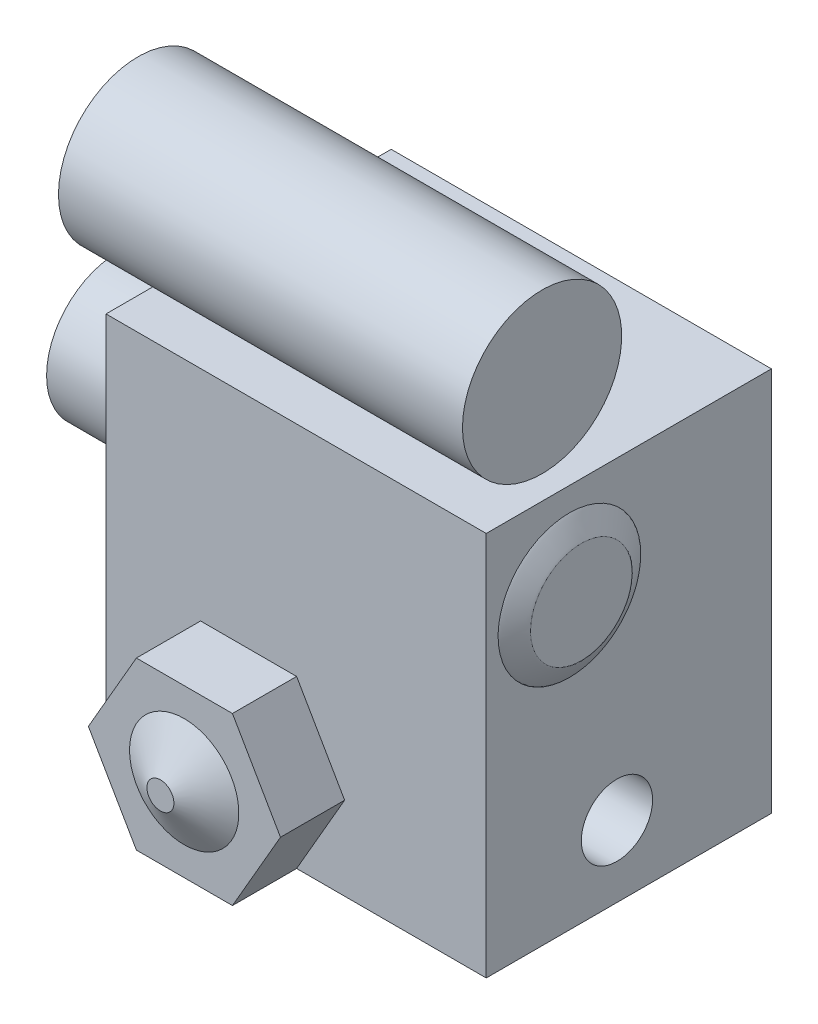
ISO-10303-21;
HEADER;
FILE_DESCRIPTION(('STEP AP214'),'2;1');
FILE_NAME('part.step','',(''),(''),'','','');
FILE_SCHEMA(('AUTOMOTIVE_DESIGN { 1 0 10303 214 1 1 1 1 }'));
ENDSEC;
DATA;
#1=APPLICATION_CONTEXT('core data for automotive mechanical design processes');
#2=APPLICATION_PROTOCOL_DEFINITION('international standard','automotive_design',2000,#1);
#3=PRODUCT_CONTEXT('',#1,'mechanical');
#4=PRODUCT('Part','Part','',(#3));
#5=PRODUCT_RELATED_PRODUCT_CATEGORY('part','',(#4));
#6=PRODUCT_DEFINITION_FORMATION('','',#4);
#7=PRODUCT_DEFINITION_CONTEXT('part definition',#1,'design');
#8=PRODUCT_DEFINITION('design','',#6,#7);
#9=PRODUCT_DEFINITION_SHAPE('','',#8);
#10=(LENGTH_UNIT() NAMED_UNIT(*) SI_UNIT(.MILLI.,.METRE.));
#11=(NAMED_UNIT(*) PLANE_ANGLE_UNIT() SI_UNIT($,.RADIAN.));
#12=(NAMED_UNIT(*) SI_UNIT($,.STERADIAN.) SOLID_ANGLE_UNIT());
#13=UNCERTAINTY_MEASURE_WITH_UNIT(LENGTH_MEASURE(1.E-05),#10,'distance_accuracy_value','');
#14=(GEOMETRIC_REPRESENTATION_CONTEXT(3) GLOBAL_UNCERTAINTY_ASSIGNED_CONTEXT((#13)) GLOBAL_UNIT_ASSIGNED_CONTEXT((#10,
#11,#12)) REPRESENTATION_CONTEXT('',''));
#15=CARTESIAN_POINT('',(0.,0.,0.));
#16=DIRECTION('',(0.,0.,1.));
#17=DIRECTION('',(1.,0.,0.));
#18=AXIS2_PLACEMENT_3D('',#15,#16,#17);
#19=CARTESIAN_POINT('',(-10.,19.55,2.65));
#20=DIRECTION('',(1.,0.,0.));
#21=DIRECTION('',(0.,0.,-1.));
#22=AXIS2_PLACEMENT_3D('',#19,#20,#21);
#23=CYLINDRICAL_SURFACE('',#22,3.35);
#24=CARTESIAN_POINT('',(-10.,19.55,2.65));
#25=DIRECTION('',(-1.,0.,0.));
#26=DIRECTION('',(0.,0.,1.));
#27=AXIS2_PLACEMENT_3D('',#24,#25,#26);
#28=CIRCLE('',#27,3.35);
#29=CARTESIAN_POINT('',(-9.99999999999999,19.55,6.));
#30=VERTEX_POINT('',#29);
#31=EDGE_CURVE('E11',#30,#30,#28,.T.);
#32=ORIENTED_EDGE('',*,*,#31,.F.);
#33=EDGE_LOOP('',(#32));
#34=FACE_BOUND('',#33,.T.);
#35=CARTESIAN_POINT('',(7.00000000000001,19.55,2.64999999999999));
#36=DIRECTION('',(-1.,0.,0.));
#37=DIRECTION('',(0.,0.,1.));
#38=AXIS2_PLACEMENT_3D('',#35,#36,#37);
#39=CIRCLE('',#38,3.35);
#40=CARTESIAN_POINT('',(7.00000000000001,19.55,5.99999999999999));
#41=VERTEX_POINT('',#40);
#42=EDGE_CURVE('E56',#41,#41,#39,.T.);
#43=ORIENTED_EDGE('',*,*,#42,.T.);
#44=EDGE_LOOP('',(#43));
#45=FACE_BOUND('',#44,.T.);
#46=ADVANCED_FACE('F50',(#34,#45),#23,.T.);
#47=CARTESIAN_POINT('',(-10.,19.55,2.65));
#48=DIRECTION('',(-1.,0.,0.));
#49=DIRECTION('',(0.,0.,1.));
#50=AXIS2_PLACEMENT_3D('',#47,#48,#49);
#51=PLANE('',#50);
#52=ORIENTED_EDGE('',*,*,#31,.T.);
#53=EDGE_LOOP('',(#52));
#54=FACE_BOUND('',#53,.T.);
#55=ADVANCED_FACE('F65',(#54),#51,.T.);
#56=CARTESIAN_POINT('',(7.00000000000001,19.55,2.64999999999999));
#57=DIRECTION('',(-1.,0.,0.));
#58=DIRECTION('',(0.,0.,1.));
#59=AXIS2_PLACEMENT_3D('',#56,#57,#58);
#60=PLANE('',#59);
#61=ORIENTED_EDGE('',*,*,#42,.F.);
#62=EDGE_LOOP('',(#61));
#63=FACE_BOUND('',#62,.T.);
#64=ADVANCED_FACE('F63',(#63),#60,.F.);
#65=CLOSED_SHELL('',(#46,#55,#64));
#66=MANIFOLD_SOLID_BREP('B2',#65);
#67=CARTESIAN_POINT('',(-4.02072594216369,0.,8.7));
#68=DIRECTION('',(0.,1.,0.));
#69=DIRECTION('',(0.,0.,1.));
#70=AXIS2_PLACEMENT_3D('',#67,#68,#69);
#71=PLANE('',#70);
#72=DIRECTION('',(1.,0.,0.));
#73=VECTOR('',#72,1.);
#74=CARTESIAN_POINT('',(-4.02072594216369,0.,6.));
#75=LINE('',#74,#73);
#76=CARTESIAN_POINT('',(-4.02072594216369,0.,6.));
#77=VERTEX_POINT('',#76);
#78=CARTESIAN_POINT('',(0.0207259421636952,0.,6.));
#79=VERTEX_POINT('',#78);
#80=EDGE_CURVE('E200',#77,#79,#75,.T.);
#81=ORIENTED_EDGE('',*,*,#80,.T.);
#82=DIRECTION('',(0.,0.,-1.));
#83=VECTOR('',#82,1.);
#84=CARTESIAN_POINT('',(0.0207259421636952,0.,8.7));
#85=LINE('',#84,#83);
#86=CARTESIAN_POINT('',(0.0207259421636952,0.,8.7));
#87=VERTEX_POINT('',#86);
#88=EDGE_CURVE('E216',#87,#79,#85,.T.);
#89=ORIENTED_EDGE('',*,*,#88,.F.);
#90=DIRECTION('',(1.,0.,0.));
#91=VECTOR('',#90,1.);
#92=CARTESIAN_POINT('',(-4.02072594216369,0.,8.7));
#93=LINE('',#92,#91);
#94=CARTESIAN_POINT('',(-4.02072594216369,0.,8.7));
#95=VERTEX_POINT('',#94);
#96=EDGE_CURVE('E210',#95,#87,#93,.T.);
#97=ORIENTED_EDGE('',*,*,#96,.F.);
#98=DIRECTION('',(0.,0.,-1.));
#99=VECTOR('',#98,1.);
#100=CARTESIAN_POINT('',(-4.02072594216369,0.,8.7));
#101=LINE('',#100,#99);
#102=EDGE_CURVE('E196',#95,#77,#101,.T.);
#103=ORIENTED_EDGE('',*,*,#102,.T.);
#104=EDGE_LOOP('',(#81,#89,#97,#103));
#105=FACE_BOUND('',#104,.T.);
#106=ADVANCED_FACE('F113',(#105),#71,.F.);
#107=CARTESIAN_POINT('',(0.0207259421636952,0.,8.7));
#108=DIRECTION('',(-0.866025403784439,0.5,0.));
#109=DIRECTION('',(-0.5,-0.866025403784439,0.));
#110=AXIS2_PLACEMENT_3D('',#107,#108,#109);
#111=PLANE('',#110);
#112=DIRECTION('',(0.5,0.866025403784439,0.));
#113=VECTOR('',#112,1.);
#114=CARTESIAN_POINT('',(0.0207259421636952,0.,6.));
#115=LINE('',#114,#113);
#116=CARTESIAN_POINT('',(2.04145188432739,3.5,6.));
#117=VERTEX_POINT('',#116);
#118=EDGE_CURVE('E203',#79,#117,#115,.T.);
#119=ORIENTED_EDGE('',*,*,#118,.T.);
#120=DIRECTION('',(0.,0.,-1.));
#121=VECTOR('',#120,1.);
#122=CARTESIAN_POINT('',(2.04145188432739,3.5,8.7));
#123=LINE('',#122,#121);
#124=CARTESIAN_POINT('',(2.04145188432739,3.5,8.7));
#125=VERTEX_POINT('',#124);
#126=EDGE_CURVE('E214',#125,#117,#123,.T.);
#127=ORIENTED_EDGE('',*,*,#126,.F.);
#128=DIRECTION('',(0.5,0.866025403784439,0.));
#129=VECTOR('',#128,1.);
#130=CARTESIAN_POINT('',(0.0207259421636952,0.,8.7));
#131=LINE('',#130,#129);
#132=EDGE_CURVE('E169',#87,#125,#131,.T.);
#133=ORIENTED_EDGE('',*,*,#132,.F.);
#134=ORIENTED_EDGE('',*,*,#88,.T.);
#135=EDGE_LOOP('',(#119,#127,#133,#134));
#136=FACE_BOUND('',#135,.T.);
#137=ADVANCED_FACE('F225',(#136),#111,.F.);
#138=CARTESIAN_POINT('',(2.04145188432739,3.5,8.7));
#139=DIRECTION('',(-0.866025403784439,-0.5,0.));
#140=DIRECTION('',(0.5,-0.866025403784439,0.));
#141=AXIS2_PLACEMENT_3D('',#138,#139,#140);
#142=PLANE('',#141);
#143=DIRECTION('',(-0.5,0.866025403784439,0.));
#144=VECTOR('',#143,1.);
#145=CARTESIAN_POINT('',(2.04145188432739,3.5,6.));
#146=LINE('',#145,#144);
#147=CARTESIAN_POINT('',(0.020725942163697,7.,6.));
#148=VERTEX_POINT('',#147);
#149=EDGE_CURVE('E205',#117,#148,#146,.T.);
#150=ORIENTED_EDGE('',*,*,#149,.T.);
#151=DIRECTION('',(0.,0.,-1.));
#152=VECTOR('',#151,1.);
#153=CARTESIAN_POINT('',(0.020725942163697,7.,8.7));
#154=LINE('',#153,#152);
#155=CARTESIAN_POINT('',(0.020725942163697,7.,8.7));
#156=VERTEX_POINT('',#155);
#157=EDGE_CURVE('E191',#156,#148,#154,.T.);
#158=ORIENTED_EDGE('',*,*,#157,.F.);
#159=DIRECTION('',(-0.5,0.866025403784439,0.));
#160=VECTOR('',#159,1.);
#161=CARTESIAN_POINT('',(2.04145188432739,3.5,8.7));
#162=LINE('',#161,#160);
#163=EDGE_CURVE('E182',#125,#156,#162,.T.);
#164=ORIENTED_EDGE('',*,*,#163,.F.);
#165=ORIENTED_EDGE('',*,*,#126,.T.);
#166=EDGE_LOOP('',(#150,#158,#164,#165));
#167=FACE_BOUND('',#166,.T.);
#168=ADVANCED_FACE('F228',(#167),#142,.F.);
#169=CARTESIAN_POINT('',(0.020725942163697,7.,8.7));
#170=DIRECTION('',(0.,-1.,0.));
#171=DIRECTION('',(0.,0.,-1.));
#172=AXIS2_PLACEMENT_3D('',#169,#170,#171);
#173=PLANE('',#172);
#174=DIRECTION('',(-1.,0.,0.));
#175=VECTOR('',#174,1.);
#176=CARTESIAN_POINT('',(0.020725942163697,7.,6.));
#177=LINE('',#176,#175);
#178=CARTESIAN_POINT('',(-4.02072594216368,7.,6.));
#179=VERTEX_POINT('',#178);
#180=EDGE_CURVE('E190',#148,#179,#177,.T.);
#181=ORIENTED_EDGE('',*,*,#180,.T.);
#182=DIRECTION('',(0.,0.,-1.));
#183=VECTOR('',#182,1.);
#184=CARTESIAN_POINT('',(-4.02072594216368,7.,8.7));
#185=LINE('',#184,#183);
#186=CARTESIAN_POINT('',(-4.02072594216368,7.,8.7));
#187=VERTEX_POINT('',#186);
#188=EDGE_CURVE('E187',#187,#179,#185,.T.);
#189=ORIENTED_EDGE('',*,*,#188,.F.);
#190=DIRECTION('',(-1.,0.,0.));
#191=VECTOR('',#190,1.);
#192=CARTESIAN_POINT('',(0.020725942163697,7.,8.7));
#193=LINE('',#192,#191);
#194=EDGE_CURVE('E176',#156,#187,#193,.T.);
#195=ORIENTED_EDGE('',*,*,#194,.F.);
#196=ORIENTED_EDGE('',*,*,#157,.T.);
#197=EDGE_LOOP('',(#181,#189,#195,#196));
#198=FACE_BOUND('',#197,.T.);
#199=ADVANCED_FACE('F188',(#198),#173,.F.);
#200=CARTESIAN_POINT('',(-4.02072594216368,7.,8.7));
#201=DIRECTION('',(0.866025403784439,-0.5,0.));
#202=DIRECTION('',(0.5,0.866025403784439,0.));
#203=AXIS2_PLACEMENT_3D('',#200,#201,#202);
#204=PLANE('',#203);
#205=DIRECTION('',(-0.5,-0.866025403784439,0.));
#206=VECTOR('',#205,1.);
#207=CARTESIAN_POINT('',(-4.02072594216368,7.,6.));
#208=LINE('',#207,#206);
#209=CARTESIAN_POINT('',(-6.04145188432738,3.5,6.));
#210=VERTEX_POINT('',#209);
#211=EDGE_CURVE('E154',#179,#210,#208,.T.);
#212=ORIENTED_EDGE('',*,*,#211,.T.);
#213=DIRECTION('',(0.,0.,-1.));
#214=VECTOR('',#213,1.);
#215=CARTESIAN_POINT('',(-6.04145188432738,3.5,8.7));
#216=LINE('',#215,#214);
#217=CARTESIAN_POINT('',(-6.04145188432738,3.5,8.7));
#218=VERTEX_POINT('',#217);
#219=EDGE_CURVE('E192',#218,#210,#216,.T.);
#220=ORIENTED_EDGE('',*,*,#219,.F.);
#221=DIRECTION('',(-0.5,-0.866025403784439,0.));
#222=VECTOR('',#221,1.);
#223=CARTESIAN_POINT('',(-4.02072594216368,7.,8.7));
#224=LINE('',#223,#222);
#225=EDGE_CURVE('E180',#187,#218,#224,.T.);
#226=ORIENTED_EDGE('',*,*,#225,.F.);
#227=ORIENTED_EDGE('',*,*,#188,.T.);
#228=EDGE_LOOP('',(#212,#220,#226,#227));
#229=FACE_BOUND('',#228,.T.);
#230=ADVANCED_FACE('F194',(#229),#204,.F.);
#231=CARTESIAN_POINT('',(-6.04145188432738,3.5,8.7));
#232=DIRECTION('',(0.866025403784439,0.5,0.));
#233=DIRECTION('',(-0.5,0.866025403784439,0.));
#234=AXIS2_PLACEMENT_3D('',#231,#232,#233);
#235=PLANE('',#234);
#236=DIRECTION('',(0.5,-0.866025403784439,0.));
#237=VECTOR('',#236,1.);
#238=CARTESIAN_POINT('',(-6.04145188432738,3.5,6.));
#239=LINE('',#238,#237);
#240=EDGE_CURVE('E160',#210,#77,#239,.T.);
#241=ORIENTED_EDGE('',*,*,#240,.T.);
#242=ORIENTED_EDGE('',*,*,#102,.F.);
#243=DIRECTION('',(0.5,-0.866025403784439,0.));
#244=VECTOR('',#243,1.);
#245=CARTESIAN_POINT('',(-6.04145188432738,3.5,8.7));
#246=LINE('',#245,#244);
#247=EDGE_CURVE('E131',#218,#95,#246,.T.);
#248=ORIENTED_EDGE('',*,*,#247,.F.);
#249=ORIENTED_EDGE('',*,*,#219,.T.);
#250=EDGE_LOOP('',(#241,#242,#248,#249));
#251=FACE_BOUND('',#250,.T.);
#252=ADVANCED_FACE('F233',(#251),#235,.F.);
#253=CARTESIAN_POINT('',(0.,0.,8.7));
#254=DIRECTION('',(0.,0.,1.));
#255=DIRECTION('',(1.,0.,0.));
#256=AXIS2_PLACEMENT_3D('',#253,#254,#255);
#257=PLANE('',#256);
#258=CARTESIAN_POINT('',(-2.01036297108184,3.5,8.7));
#259=DIRECTION('',(0.,0.,1.));
#260=DIRECTION('',(1.,0.,0.));
#261=AXIS2_PLACEMENT_3D('',#258,#259,#260);
#262=CIRCLE('',#261,2.3);
#263=CARTESIAN_POINT('',(-4.31036297108184,3.5,8.7));
#264=VERTEX_POINT('',#263);
#265=EDGE_CURVE('E123',#264,#264,#262,.T.);
#266=ORIENTED_EDGE('',*,*,#265,.F.);
#267=EDGE_LOOP('',(#266));
#268=FACE_BOUND('',#267,.T.);
#269=ORIENTED_EDGE('',*,*,#96,.T.);
#270=ORIENTED_EDGE('',*,*,#132,.T.);
#271=ORIENTED_EDGE('',*,*,#163,.T.);
#272=ORIENTED_EDGE('',*,*,#194,.T.);
#273=ORIENTED_EDGE('',*,*,#225,.T.);
#274=ORIENTED_EDGE('',*,*,#247,.T.);
#275=EDGE_LOOP('',(#269,#270,#271,#272,#273,#274));
#276=FACE_BOUND('',#275,.T.);
#277=ADVANCED_FACE('F178',(#268,#276),#257,.T.);
#278=CARTESIAN_POINT('',(0.,0.,6.));
#279=DIRECTION('',(0.,0.,1.));
#280=DIRECTION('',(1.,0.,0.));
#281=AXIS2_PLACEMENT_3D('',#278,#279,#280);
#282=PLANE('',#281);
#283=ORIENTED_EDGE('',*,*,#80,.F.);
#284=ORIENTED_EDGE('',*,*,#240,.F.);
#285=ORIENTED_EDGE('',*,*,#211,.F.);
#286=ORIENTED_EDGE('',*,*,#180,.F.);
#287=ORIENTED_EDGE('',*,*,#149,.F.);
#288=ORIENTED_EDGE('',*,*,#118,.F.);
#289=EDGE_LOOP('',(#283,#284,#285,#286,#287,#288));
#290=FACE_BOUND('',#289,.T.);
#291=ADVANCED_FACE('F231',(#290),#282,.F.);
#292=CARTESIAN_POINT('',(-2.01036297108184,3.5,9.7));
#293=DIRECTION('',(0.,0.,1.));
#294=DIRECTION('',(1.,0.,0.));
#295=AXIS2_PLACEMENT_3D('',#292,#293,#294);
#296=PLANE('',#295);
#297=CARTESIAN_POINT('',(-2.01036297108184,3.5,9.7));
#298=DIRECTION('',(0.,0.,1.));
#299=DIRECTION('',(1.,0.,0.));
#300=AXIS2_PLACEMENT_3D('',#297,#298,#299);
#301=CIRCLE('',#300,0.567949192431125);
#302=CARTESIAN_POINT('',(-2.57831216351297,3.5,9.7));
#303=VERTEX_POINT('',#302);
#304=EDGE_CURVE('E48',#303,#303,#301,.T.);
#305=ORIENTED_EDGE('',*,*,#304,.T.);
#306=EDGE_LOOP('',(#305));
#307=FACE_BOUND('',#306,.T.);
#308=ADVANCED_FACE('F281',(#307),#296,.T.);
#309=CARTESIAN_POINT('',(-2.01036297108184,3.5,9.7));
#310=DIRECTION('',(0.,0.,-1.));
#311=DIRECTION('',(-1.,0.,0.));
#312=AXIS2_PLACEMENT_3D('',#309,#310,#311);
#313=CONICAL_SURFACE('',#312,0.567949192431125,1.0471975511966);
#314=CARTESIAN_POINT('',(-4.31036297108184,3.5,8.7));
#315=CARTESIAN_POINT('',(-4.29232077516967,3.5,8.71041666666667));
#316=CARTESIAN_POINT('',(-4.27427857925749,3.5,8.72083333333333));
#317=CARTESIAN_POINT('',(-4.23819418743314,3.5,8.74166666666667));
#318=CARTESIAN_POINT('',(-4.22015199152097,3.5,8.75208333333333));
#319=CARTESIAN_POINT('',(-4.18406759969661,3.5,8.77291666666667));
#320=CARTESIAN_POINT('',(-4.16602540378444,3.5,8.78333333333333));
#321=CARTESIAN_POINT('',(-4.12994101196009,3.5,8.80416666666667));
#322=CARTESIAN_POINT('',(-4.11189881604791,3.5,8.81458333333333));
#323=CARTESIAN_POINT('',(-4.07581442422356,3.5,8.83541666666667));
#324=CARTESIAN_POINT('',(-4.05777222831138,3.5,8.84583333333333));
#325=CARTESIAN_POINT('',(-4.02168783648703,3.5,8.86666666666667));
#326=CARTESIAN_POINT('',(-4.00364564057486,3.5,8.87708333333333));
#327=CARTESIAN_POINT('',(-3.9675612487505,3.5,8.89791666666667));
#328=CARTESIAN_POINT('',(-3.94951905283833,3.5,8.90833333333333));
#329=CARTESIAN_POINT('',(-3.91343466101398,3.5,8.92916666666667));
#330=CARTESIAN_POINT('',(-3.8953924651018,3.5,8.93958333333333));
#331=CARTESIAN_POINT('',(-3.85930807327745,3.5,8.96041666666667));
#332=CARTESIAN_POINT('',(-3.84126587736527,3.5,8.97083333333333));
#333=CARTESIAN_POINT('',(-3.80518148554092,3.5,8.99166666666667));
#334=CARTESIAN_POINT('',(-3.78713928962875,3.5,9.00208333333333));
#335=CARTESIAN_POINT('',(-3.75105489780439,3.5,9.02291666666667));
#336=CARTESIAN_POINT('',(-3.73301270189222,3.5,9.03333333333333));
#337=CARTESIAN_POINT('',(-3.69692831006787,3.5,9.05416666666667));
#338=CARTESIAN_POINT('',(-3.67888611415569,3.5,9.06458333333333));
#339=CARTESIAN_POINT('',(-3.64280172233134,3.5,9.08541666666667));
#340=CARTESIAN_POINT('',(-3.62475952641916,3.5,9.09583333333333));
#341=CARTESIAN_POINT('',(-3.58867513459481,3.5,9.11666666666667));
#342=CARTESIAN_POINT('',(-3.57063293868264,3.5,9.12708333333333));
#343=CARTESIAN_POINT('',(-3.53454854685829,3.5,9.14791666666667));
#344=CARTESIAN_POINT('',(-3.51650635094611,3.5,9.15833333333333));
#345=CARTESIAN_POINT('',(-3.48042195912176,3.5,9.17916666666667));
#346=CARTESIAN_POINT('',(-3.46237976320958,3.5,9.18958333333333));
#347=CARTESIAN_POINT('',(-3.42629537138523,3.5,9.21041666666667));
#348=CARTESIAN_POINT('',(-3.40825317547305,3.5,9.22083333333333));
#349=CARTESIAN_POINT('',(-3.3721687836487,3.5,9.24166666666667));
#350=CARTESIAN_POINT('',(-3.35412658773653,3.5,9.25208333333333));
#351=CARTESIAN_POINT('',(-3.31804219591218,3.5,9.27291666666667));
#352=CARTESIAN_POINT('',(-3.3,3.5,9.28333333333333));
#353=CARTESIAN_POINT('',(-3.26391560817565,3.5,9.30416666666667));
#354=CARTESIAN_POINT('',(-3.24587341226347,3.5,9.31458333333333));
#355=CARTESIAN_POINT('',(-3.20978902043912,3.5,9.33541666666667));
#356=CARTESIAN_POINT('',(-3.19174682452695,3.5,9.34583333333333));
#357=CARTESIAN_POINT('',(-3.15566243270259,3.5,9.36666666666667));
#358=CARTESIAN_POINT('',(-3.13762023679042,3.5,9.37708333333333));
#359=CARTESIAN_POINT('',(-3.10153584496607,3.5,9.39791666666667));
#360=CARTESIAN_POINT('',(-3.08349364905389,3.5,9.40833333333333));
#361=CARTESIAN_POINT('',(-3.04740925722954,3.5,9.42916666666667));
#362=CARTESIAN_POINT('',(-3.02936706131736,3.5,9.43958333333333));
#363=CARTESIAN_POINT('',(-2.99328266949301,3.5,9.46041666666667));
#364=CARTESIAN_POINT('',(-2.97524047358084,3.5,9.47083333333333));
#365=CARTESIAN_POINT('',(-2.93915608175648,3.5,9.49166666666667));
#366=CARTESIAN_POINT('',(-2.92111388584431,3.5,9.50208333333333));
#367=CARTESIAN_POINT('',(-2.88502949401996,3.5,9.52291666666667));
#368=CARTESIAN_POINT('',(-2.86698729810778,3.5,9.53333333333333));
#369=CARTESIAN_POINT('',(-2.83090290628343,3.5,9.55416666666667));
#370=CARTESIAN_POINT('',(-2.81286071037125,3.5,9.56458333333333));
#371=CARTESIAN_POINT('',(-2.7767763185469,3.5,9.58541666666667));
#372=CARTESIAN_POINT('',(-2.75873412263473,3.5,9.59583333333333));
#373=CARTESIAN_POINT('',(-2.72264973081037,3.5,9.61666666666667));
#374=CARTESIAN_POINT('',(-2.7046075348982,3.5,9.62708333333333));
#375=CARTESIAN_POINT('',(-2.66852314307385,3.5,9.64791666666667));
#376=CARTESIAN_POINT('',(-2.65048094716167,3.5,9.65833333333333));
#377=CARTESIAN_POINT('',(-2.61439655533732,3.5,9.67916666666667));
#378=CARTESIAN_POINT('',(-2.59635435942514,3.5,9.68958333333333));
#379=CARTESIAN_POINT('',(-2.57831216351297,3.5,9.7));
#380=B_SPLINE_CURVE_WITH_KNOTS('',3,(#314,#315,#316,#317,#318,#319,#320,#321,#322,#323,#324,
#325,#326,#327,#328,#329,#330,#331,#332,#333,#334,#335,#336,#337,#338,#339,#340,#341,#342,#343,
#344,#345,#346,#347,#348,#349,#350,#351,#352,#353,#354,#355,#356,#357,#358,#359,#360,#361,#362,
#363,#364,#365,#366,#367,#368,#369,#370,#371,#372,#373,#374,#375,#376,#377,#378,#379),
.UNSPECIFIED.,.F.,.F.,(4,2,2,2,2,2,2,2,2,2,2,2,2,2,2,2,2,2,2,2,2,2,2,2,2,2,2,2,2,2,2,2,4),(0.,
0.0625000000000002,0.125,0.1875,0.25,0.3125,0.375,0.4375,0.5,0.5625,0.625,0.6875,0.75,0.8125,
0.875,0.9375,0.999999999999999,1.0625,1.125,1.1875,1.25,1.3125,1.375,1.4375,1.5,1.5625,1.625,
1.6875,1.75,1.8125,1.875,1.9375,2.),.UNSPECIFIED.);
#381=EDGE_CURVE('BSEAM116',#264,#303,#380,.T.);
#382=ORIENTED_EDGE('',*,*,#265,.T.);
#383=ORIENTED_EDGE('',*,*,#304,.F.);
#384=ORIENTED_EDGE('',*,*,#381,.T.);
#385=ORIENTED_EDGE('',*,*,#381,.F.);
#386=EDGE_LOOP('',(#382,#384,#383,#385));
#387=FACE_BOUND('',#386,.T.);
#388=ADVANCED_FACE('F116',(#387),#313,.T.);
#389=CLOSED_SHELL('',(#106,#137,#168,#199,#230,#252,#277,#291,#308,#388));
#390=MANIFOLD_SOLID_BREP('B6',#389);
#391=CARTESIAN_POINT('',(8.,16.2,-6.));
#392=DIRECTION('',(-1.,0.,0.));
#393=DIRECTION('',(0.,0.,1.));
#394=AXIS2_PLACEMENT_3D('',#391,#392,#393);
#395=PLANE('',#394);
#396=CARTESIAN_POINT('',(8.,3.,0.5));
#397=DIRECTION('',(1.,0.,0.));
#398=DIRECTION('',(0.,0.,-1.));
#399=AXIS2_PLACEMENT_3D('',#396,#397,#398);
#400=CIRCLE('',#399,1.5);
#401=CARTESIAN_POINT('',(8.,3.,-1.));
#402=VERTEX_POINT('',#401);
#403=EDGE_CURVE('E502',#402,#402,#400,.T.);
#404=ORIENTED_EDGE('',*,*,#403,.F.);
#405=EDGE_LOOP('',(#404));
#406=FACE_BOUND('',#405,.T.);
#407=CARTESIAN_POINT('',(7.99999999999998,12.2,5.49999999999996));
#408=CARTESIAN_POINT('',(7.99999999999998,11.8073009326731,5.49999999999996));
#409=CARTESIAN_POINT('',(7.99999999999998,11.4147563336431,5.42191802450454));
#410=CARTESIAN_POINT('',(7.99999999999998,10.6891430721664,5.12135917056311));
#411=CARTESIAN_POINT('',(7.99999999999998,10.3563598299123,4.89900051703164));
#412=CARTESIAN_POINT('',(7.99999999999998,9.80099948296848,4.34364017008759));
#413=CARTESIAN_POINT('',(7.99999999999998,9.57864082943682,4.01085692783416));
#414=CARTESIAN_POINT('',(7.99999999999998,9.27808197549553,3.28524366635635));
#415=CARTESIAN_POINT('',(7.99999999999998,9.20000000000003,2.89269906732584));
#416=CARTESIAN_POINT('',(7.99999999999998,9.20000000000003,2.10730093267414));
#417=CARTESIAN_POINT('',(7.99999999999998,9.27808197549529,1.71475633364391));
#418=CARTESIAN_POINT('',(7.99999999999998,9.57864082943706,0.989143072165562));
#419=CARTESIAN_POINT('',(7.99999999999998,9.80099948296861,0.656359829912376));
#420=CARTESIAN_POINT('',(7.99999999999998,10.3563598299122,0.100999482968377));
#421=CARTESIAN_POINT('',(7.99999999999998,10.6891430721653,-0.121359170562734));
#422=CARTESIAN_POINT('',(7.99999999999998,11.4147563336442,-0.421918024504933));
#423=CARTESIAN_POINT('',(7.99999999999998,11.807300932673,-0.49999999999997));
#424=CARTESIAN_POINT('',(7.99999999999998,12.592699067327,-0.49999999999997));
#425=CARTESIAN_POINT('',(7.99999999999998,12.9852436663561,-0.421918024504842));
#426=CARTESIAN_POINT('',(7.99999999999998,13.7108569278344,-0.121359170562824));
#427=CARTESIAN_POINT('',(7.99999999999998,14.0436401700874,0.100999482967908));
#428=CARTESIAN_POINT('',(7.99999999999998,14.5990005170319,0.656359829912846));
#429=CARTESIAN_POINT('',(7.99999999999998,14.8213591705629,0.989143072165896));
#430=CARTESIAN_POINT('',(7.99999999999998,15.1219180245047,1.71475633364358));
#431=CARTESIAN_POINT('',(7.99999999999998,15.2,2.10730093267378));
#432=CARTESIAN_POINT('',(7.99999999999998,15.2,2.89269906732621));
#433=CARTESIAN_POINT('',(7.99999999999998,15.1219180245047,3.28524366635598));
#434=CARTESIAN_POINT('',(7.99999999999998,14.8213591705629,4.01085692783452));
#435=CARTESIAN_POINT('',(7.99999999999998,14.5990005170315,4.34364017008759));
#436=CARTESIAN_POINT('',(7.99999999999998,14.0436401700877,4.89900051703164));
#437=CARTESIAN_POINT('',(7.99999999999998,13.7108569278343,5.12135917056274));
#438=CARTESIAN_POINT('',(7.99999999999998,12.9852436663562,5.4219180245049));
#439=CARTESIAN_POINT('',(7.99999999999998,12.5926990673269,5.49999999999996));
#440=CARTESIAN_POINT('',(7.99999999999998,12.2,5.49999999999996));
#441=(BOUNDED_CURVE() B_SPLINE_CURVE(3,(#407,#408,#409,#410,#411,#412,#413,#414,#415,#416,#417,
#418,#419,#420,#421,#422,#423,#424,#425,#426,#427,#428,#429,#430,#431,#432,#433,#434,#435,#436,
#437,#438,#439,#440),.UNSPECIFIED.,.T.,.F.) B_SPLINE_CURVE_WITH_KNOTS((4,2,2,2,2,2,2,2,2,2,2,2,
2,2,2,2,4),(-3.14159265358979,-2.74889357189107,-2.35619449019234,-1.96349540849362,
-1.5707963267949,-1.17809724509617,-0.785398163397448,-0.392699081698724,0.,0.392699081698724,
0.785398163397448,1.17809724509617,1.5707963267949,1.96349540849362,2.35619449019234,
2.74889357189107,3.14159265358979),
.UNSPECIFIED.) CURVE() GEOMETRIC_REPRESENTATION_ITEM() RATIONAL_B_SPLINE_CURVE((1.,1.,1.,1.,1.,
1.,1.,1.,1.,1.,1.,1.,1.,1.,1.,1.,1.,1.,1.,1.,1.,1.,1.,1.,1.,1.,1.,1.,1.,1.,1.,1.,1.,1.)) REPRESENTATION_ITEM(''));
#442=CARTESIAN_POINT('',(7.99999999999998,12.2,5.49999999999996));
#443=VERTEX_POINT('',#442);
#444=EDGE_CURVE('E379',#443,#443,#441,.T.);
#445=ORIENTED_EDGE('',*,*,#444,.F.);
#446=EDGE_LOOP('',(#445));
#447=FACE_BOUND('',#446,.T.);
#448=DIRECTION('',(0.,0.,-1.));
#449=VECTOR('',#448,1.);
#450=CARTESIAN_POINT('',(8.,0.,-6.));
#451=LINE('',#450,#449);
#452=CARTESIAN_POINT('',(8.,0.,6.));
#453=VERTEX_POINT('',#452);
#454=CARTESIAN_POINT('',(8.,0.,-6.));
#455=VERTEX_POINT('',#454);
#456=EDGE_CURVE('E438',#453,#455,#451,.T.);
#457=ORIENTED_EDGE('',*,*,#456,.T.);
#458=DIRECTION('',(0.,-1.,0.));
#459=VECTOR('',#458,1.);
#460=CARTESIAN_POINT('',(8.,16.2,-6.));
#461=LINE('',#460,#459);
#462=CARTESIAN_POINT('',(8.,16.2,-6.));
#463=VERTEX_POINT('',#462);
#464=EDGE_CURVE('E429',#463,#455,#461,.T.);
#465=ORIENTED_EDGE('',*,*,#464,.F.);
#466=DIRECTION('',(0.,0.,-1.));
#467=VECTOR('',#466,1.);
#468=CARTESIAN_POINT('',(8.,16.2,-6.));
#469=LINE('',#468,#467);
#470=CARTESIAN_POINT('',(8.,16.2,6.));
#471=VERTEX_POINT('',#470);
#472=EDGE_CURVE('E423',#471,#463,#469,.T.);
#473=ORIENTED_EDGE('',*,*,#472,.F.);
#474=DIRECTION('',(0.,-1.,0.));
#475=VECTOR('',#474,1.);
#476=CARTESIAN_POINT('',(8.,16.2,6.));
#477=LINE('',#476,#475);
#478=EDGE_CURVE('E434',#471,#453,#477,.T.);
#479=ORIENTED_EDGE('',*,*,#478,.T.);
#480=EDGE_LOOP('',(#457,#465,#473,#479));
#481=FACE_BOUND('',#480,.T.);
#482=ADVANCED_FACE('F364',(#406,#447,#481),#395,.F.);
#483=CARTESIAN_POINT('',(-8.,16.2,-6.));
#484=DIRECTION('',(0.,0.,1.));
#485=DIRECTION('',(1.,0.,0.));
#486=AXIS2_PLACEMENT_3D('',#483,#484,#485);
#487=PLANE('',#486);
#488=CARTESIAN_POINT('',(-2.01036297108184,3.5,-6.));
#489=DIRECTION('',(0.,0.,-1.));
#490=DIRECTION('',(-1.,0.,0.));
#491=AXIS2_PLACEMENT_3D('',#488,#489,#490);
#492=CIRCLE('',#491,2.85);
#493=CARTESIAN_POINT('',(-4.86036297108184,3.5,-6.));
#494=VERTEX_POINT('',#493);
#495=EDGE_CURVE('E510',#494,#494,#492,.T.);
#496=ORIENTED_EDGE('',*,*,#495,.F.);
#497=EDGE_LOOP('',(#496));
#498=FACE_BOUND('',#497,.T.);
#499=DIRECTION('',(-1.,0.,0.));
#500=VECTOR('',#499,1.);
#501=CARTESIAN_POINT('',(-8.,0.,-6.));
#502=LINE('',#501,#500);
#503=CARTESIAN_POINT('',(-8.,0.,-6.));
#504=VERTEX_POINT('',#503);
#505=EDGE_CURVE('E428',#455,#504,#502,.T.);
#506=ORIENTED_EDGE('',*,*,#505,.T.);
#507=DIRECTION('',(0.,-1.,0.));
#508=VECTOR('',#507,1.);
#509=CARTESIAN_POINT('',(-8.,16.2,-6.));
#510=LINE('',#509,#508);
#511=CARTESIAN_POINT('',(-8.,16.2,-6.));
#512=VERTEX_POINT('',#511);
#513=EDGE_CURVE('E426',#512,#504,#510,.T.);
#514=ORIENTED_EDGE('',*,*,#513,.F.);
#515=DIRECTION('',(-1.,0.,0.));
#516=VECTOR('',#515,1.);
#517=CARTESIAN_POINT('',(-8.,16.2,-6.));
#518=LINE('',#517,#516);
#519=EDGE_CURVE('E418',#463,#512,#518,.T.);
#520=ORIENTED_EDGE('',*,*,#519,.F.);
#521=ORIENTED_EDGE('',*,*,#464,.T.);
#522=EDGE_LOOP('',(#506,#514,#520,#521));
#523=FACE_BOUND('',#522,.T.);
#524=ADVANCED_FACE('F427',(#498,#523),#487,.F.);
#525=CARTESIAN_POINT('',(-8.,16.2,-6.));
#526=DIRECTION('',(1.,0.,0.));
#527=DIRECTION('',(0.,0.,-1.));
#528=AXIS2_PLACEMENT_3D('',#525,#526,#527);
#529=PLANE('',#528);
#530=CARTESIAN_POINT('',(-8.,12.2,2.5));
#531=DIRECTION('',(1.,0.,0.));
#532=DIRECTION('',(0.,0.,-1.));
#533=AXIS2_PLACEMENT_3D('',#530,#531,#532);
#534=CIRCLE('',#533,3.);
#535=CARTESIAN_POINT('',(-8.,12.2,-0.500000000000002));
#536=VERTEX_POINT('',#535);
#537=EDGE_CURVE('E448',#536,#536,#534,.F.);
#538=ORIENTED_EDGE('',*,*,#537,.F.);
#539=EDGE_LOOP('',(#538));
#540=FACE_BOUND('',#539,.T.);
#541=DIRECTION('',(0.,0.,1.));
#542=VECTOR('',#541,1.);
#543=CARTESIAN_POINT('',(-8.,0.,-6.));
#544=LINE('',#543,#542);
#545=CARTESIAN_POINT('',(-7.99999999999999,0.,6.));
#546=VERTEX_POINT('',#545);
#547=EDGE_CURVE('E404',#504,#546,#544,.T.);
#548=ORIENTED_EDGE('',*,*,#547,.T.);
#549=DIRECTION('',(0.,-1.,0.));
#550=VECTOR('',#549,1.);
#551=CARTESIAN_POINT('',(-7.99999999999999,16.2,6.));
#552=LINE('',#551,#550);
#553=CARTESIAN_POINT('',(-7.99999999999999,16.2,6.));
#554=VERTEX_POINT('',#553);
#555=EDGE_CURVE('E430',#554,#546,#552,.T.);
#556=ORIENTED_EDGE('',*,*,#555,.F.);
#557=DIRECTION('',(0.,0.,1.));
#558=VECTOR('',#557,1.);
#559=CARTESIAN_POINT('',(-8.,16.2,-6.));
#560=LINE('',#559,#558);
#561=EDGE_CURVE('E421',#512,#554,#560,.T.);
#562=ORIENTED_EDGE('',*,*,#561,.F.);
#563=ORIENTED_EDGE('',*,*,#513,.T.);
#564=EDGE_LOOP('',(#548,#556,#562,#563));
#565=FACE_BOUND('',#564,.T.);
#566=ADVANCED_FACE('F432',(#540,#565),#529,.F.);
#567=CARTESIAN_POINT('',(-7.99999999999999,16.2,6.));
#568=DIRECTION('',(0.,0.,-1.));
#569=DIRECTION('',(-1.,0.,0.));
#570=AXIS2_PLACEMENT_3D('',#567,#568,#569);
#571=PLANE('',#570);
#572=DIRECTION('',(1.,0.,0.));
#573=VECTOR('',#572,1.);
#574=CARTESIAN_POINT('',(-7.99999999999999,0.,6.));
#575=LINE('',#574,#573);
#576=EDGE_CURVE('E410',#546,#453,#575,.T.);
#577=ORIENTED_EDGE('',*,*,#576,.T.);
#578=ORIENTED_EDGE('',*,*,#478,.F.);
#579=DIRECTION('',(1.,0.,0.));
#580=VECTOR('',#579,1.);
#581=CARTESIAN_POINT('',(-7.99999999999999,16.2,6.));
#582=LINE('',#581,#580);
#583=EDGE_CURVE('E387',#554,#471,#582,.T.);
#584=ORIENTED_EDGE('',*,*,#583,.F.);
#585=ORIENTED_EDGE('',*,*,#555,.T.);
#586=EDGE_LOOP('',(#577,#578,#584,#585));
#587=FACE_BOUND('',#586,.T.);
#588=ADVANCED_FACE('F483',(#587),#571,.F.);
#589=CARTESIAN_POINT('',(0.,16.2,0.));
#590=DIRECTION('',(0.,1.,0.));
#591=DIRECTION('',(0.,0.,1.));
#592=AXIS2_PLACEMENT_3D('',#589,#590,#591);
#593=PLANE('',#592);
#594=ORIENTED_EDGE('',*,*,#472,.T.);
#595=ORIENTED_EDGE('',*,*,#519,.T.);
#596=ORIENTED_EDGE('',*,*,#561,.T.);
#597=ORIENTED_EDGE('',*,*,#583,.T.);
#598=EDGE_LOOP('',(#594,#595,#596,#597));
#599=FACE_BOUND('',#598,.T.);
#600=ADVANCED_FACE('F419',(#599),#593,.T.);
#601=CARTESIAN_POINT('',(0.,0.,0.));
#602=DIRECTION('',(0.,1.,0.));
#603=DIRECTION('',(0.,0.,1.));
#604=AXIS2_PLACEMENT_3D('',#601,#602,#603);
#605=PLANE('',#604);
#606=ORIENTED_EDGE('',*,*,#456,.F.);
#607=ORIENTED_EDGE('',*,*,#576,.F.);
#608=ORIENTED_EDGE('',*,*,#547,.F.);
#609=ORIENTED_EDGE('',*,*,#505,.F.);
#610=EDGE_LOOP('',(#606,#607,#608,#609));
#611=FACE_BOUND('',#610,.T.);
#612=ADVANCED_FACE('F476',(#611),#605,.F.);
#613=CARTESIAN_POINT('',(-11.,12.2,2.5));
#614=DIRECTION('',(-1.,0.,0.));
#615=DIRECTION('',(0.,0.,1.));
#616=AXIS2_PLACEMENT_3D('',#613,#614,#615);
#617=PLANE('',#616);
#618=CARTESIAN_POINT('',(-11.,12.2,2.5));
#619=DIRECTION('',(-1.,0.,0.));
#620=DIRECTION('',(0.,0.,1.));
#621=AXIS2_PLACEMENT_3D('',#618,#619,#620);
#622=CIRCLE('',#621,3.);
#623=CARTESIAN_POINT('',(-11.,12.2,5.5));
#624=VERTEX_POINT('',#623);
#625=EDGE_CURVE('E441',#624,#624,#622,.T.);
#626=ORIENTED_EDGE('',*,*,#625,.T.);
#627=EDGE_LOOP('',(#626));
#628=FACE_BOUND('',#627,.T.);
#629=ADVANCED_FACE('F473',(#628),#617,.T.);
#630=CARTESIAN_POINT('',(-11.,12.2,2.5));
#631=DIRECTION('',(1.,0.,0.));
#632=DIRECTION('',(0.,0.,-1.));
#633=AXIS2_PLACEMENT_3D('',#630,#631,#632);
#634=CYLINDRICAL_SURFACE('',#633,3.);
#635=ORIENTED_EDGE('',*,*,#625,.F.);
#636=EDGE_LOOP('',(#635));
#637=FACE_BOUND('',#636,.T.);
#638=ORIENTED_EDGE('',*,*,#537,.T.);
#639=EDGE_LOOP('',(#638));
#640=FACE_BOUND('',#639,.T.);
#641=ADVANCED_FACE('F470',(#637,#640),#634,.T.);
#642=CARTESIAN_POINT('',(8.5,12.2,2.49999999999999));
#643=DIRECTION('',(-1.,0.,0.));
#644=DIRECTION('',(0.,0.,1.));
#645=AXIS2_PLACEMENT_3D('',#642,#643,#644);
#646=PLANE('',#645);
#647=CARTESIAN_POINT('',(8.5,12.2,4.6339745962155));
#648=CARTESIAN_POINT('',(8.5,12.479336611211,4.6339745962155));
#649=CARTESIAN_POINT('',(8.5,12.7585633452811,4.57843294550594));
#650=CARTESIAN_POINT('',(8.5,13.2747101008382,4.36463795917914));
#651=CARTESIAN_POINT('',(8.5,13.5114270958434,4.20646871988463));
#652=CARTESIAN_POINT('',(8.5,13.9064687198843,3.81142709584298));
#653=CARTESIAN_POINT('',(8.5,14.0646379591792,3.57471010083838));
#654=CARTESIAN_POINT('',(8.5,14.2784329455059,3.05856334528093));
#655=CARTESIAN_POINT('',(8.5,14.3339745962155,2.77933661121054));
#656=CARTESIAN_POINT('',(8.5,14.3339745962155,2.22066338878945));
#657=CARTESIAN_POINT('',(8.5,14.2784329455059,1.94143665471869));
#658=CARTESIAN_POINT('',(8.5,14.0646379591792,1.42528989916198));
#659=CARTESIAN_POINT('',(8.5,13.9064687198847,1.18857290415722));
#660=CARTESIAN_POINT('',(8.5,13.511427095843,0.793531280115147));
#661=CARTESIAN_POINT('',(8.5,13.2747101008383,0.635362040820733));
#662=CARTESIAN_POINT('',(8.5,12.758563345281,0.421567054494157));
#663=CARTESIAN_POINT('',(8.5,12.4793366112111,0.366025403784482));
#664=CARTESIAN_POINT('',(8.5,11.9206633887889,0.366025403784482));
#665=CARTESIAN_POINT('',(8.5,11.641436654719,0.421567054494112));
#666=CARTESIAN_POINT('',(8.5,11.1252898991616,0.635362040820779));
#667=CARTESIAN_POINT('',(8.5,10.8885729041568,0.79353128011548));
#668=CARTESIAN_POINT('',(8.5,10.4935312801156,1.18857290415688));
#669=CARTESIAN_POINT('',(8.5,10.3353620408208,1.4252898991617));
#670=CARTESIAN_POINT('',(8.5,10.1215670544941,1.94143665471897));
#671=CARTESIAN_POINT('',(8.5,10.0660254037845,2.22066338878969));
#672=CARTESIAN_POINT('',(8.5,10.0660254037845,2.7793366112103));
#673=CARTESIAN_POINT('',(8.5,10.1215670544943,3.05856334528111));
#674=CARTESIAN_POINT('',(8.5,10.3353620408206,3.5747101008382));
#675=CARTESIAN_POINT('',(8.5,10.4935312801155,3.8114270958431));
#676=CARTESIAN_POINT('',(8.5,10.8885729041569,4.20646871988451));
#677=CARTESIAN_POINT('',(8.5,11.1252898991623,4.36463795917938));
#678=CARTESIAN_POINT('',(8.5,11.6414366547184,4.5784329455057));
#679=CARTESIAN_POINT('',(8.5,11.920663388789,4.6339745962155));
#680=CARTESIAN_POINT('',(8.5,12.2,4.6339745962155));
#681=(BOUNDED_CURVE() B_SPLINE_CURVE(3,(#647,#648,#649,#650,#651,#652,#653,#654,#655,#656,#657,
#658,#659,#660,#661,#662,#663,#664,#665,#666,#667,#668,#669,#670,#671,#672,#673,#674,#675,#676,
#677,#678,#679,#680),.UNSPECIFIED.,.T.,.F.) B_SPLINE_CURVE_WITH_KNOTS((4,2,2,2,2,2,2,2,2,2,2,2,
2,2,2,2,4),(-3.14159265358979,-2.74889357189107,-2.35619449019234,-1.96349540849362,
-1.5707963267949,-1.17809724509617,-0.785398163397448,-0.392699081698724,0.,0.392699081698724,
0.785398163397448,1.17809724509617,1.5707963267949,1.96349540849362,2.35619449019234,
2.74889357189107,3.14159265358979),
.UNSPECIFIED.) CURVE() GEOMETRIC_REPRESENTATION_ITEM() RATIONAL_B_SPLINE_CURVE((1.,1.,1.,1.,1.,
1.,1.,1.,1.,1.,1.,1.,1.,1.,1.,1.,1.,1.,1.,1.,1.,1.,1.,1.,1.,1.,1.,1.,1.,1.,1.,1.,1.,1.)) REPRESENTATION_ITEM(''));
#682=CARTESIAN_POINT('',(8.5,12.2,4.6339745962155));
#683=VERTEX_POINT('',#682);
#684=EDGE_CURVE('E111',#683,#683,#681,.F.);
#685=ORIENTED_EDGE('',*,*,#684,.T.);
#686=EDGE_LOOP('',(#685));
#687=FACE_BOUND('',#686,.T.);
#688=ADVANCED_FACE('F460',(#687),#646,.F.);
#689=CARTESIAN_POINT('',(8.5,12.2,4.6339745962155));
#690=CARTESIAN_POINT('',(8.5,11.920663388789,4.6339745962155));
#691=CARTESIAN_POINT('',(8.5,11.6414366547184,4.5784329455057));
#692=CARTESIAN_POINT('',(8.5,11.1252898991623,4.36463795917938));
#693=CARTESIAN_POINT('',(8.5,10.8885729041569,4.20646871988451));
#694=CARTESIAN_POINT('',(8.5,10.4935312801155,3.8114270958431));
#695=CARTESIAN_POINT('',(8.5,10.3353620408206,3.5747101008382));
#696=CARTESIAN_POINT('',(8.5,10.1215670544943,3.05856334528111));
#697=CARTESIAN_POINT('',(8.5,10.0660254037845,2.7793366112103));
#698=CARTESIAN_POINT('',(8.5,10.0660254037845,2.22066338878969));
#699=CARTESIAN_POINT('',(8.5,10.1215670544941,1.94143665471897));
#700=CARTESIAN_POINT('',(8.5,10.3353620408208,1.4252898991617));
#701=CARTESIAN_POINT('',(8.5,10.4935312801156,1.18857290415688));
#702=CARTESIAN_POINT('',(8.5,10.8885729041568,0.79353128011548));
#703=CARTESIAN_POINT('',(8.5,11.1252898991616,0.635362040820779));
#704=CARTESIAN_POINT('',(8.5,11.641436654719,0.421567054494112));
#705=CARTESIAN_POINT('',(8.5,11.9206633887889,0.366025403784482));
#706=CARTESIAN_POINT('',(8.5,12.4793366112111,0.366025403784482));
#707=CARTESIAN_POINT('',(8.5,12.758563345281,0.421567054494157));
#708=CARTESIAN_POINT('',(8.5,13.2747101008383,0.635362040820733));
#709=CARTESIAN_POINT('',(8.5,13.511427095843,0.793531280115147));
#710=CARTESIAN_POINT('',(8.5,13.9064687198847,1.18857290415722));
#711=CARTESIAN_POINT('',(8.5,14.0646379591792,1.42528989916198));
#712=CARTESIAN_POINT('',(8.5,14.2784329455059,1.94143665471869));
#713=CARTESIAN_POINT('',(8.5,14.3339745962155,2.22066338878945));
#714=CARTESIAN_POINT('',(8.5,14.3339745962155,2.77933661121054));
#715=CARTESIAN_POINT('',(8.5,14.2784329455059,3.05856334528093));
#716=CARTESIAN_POINT('',(8.5,14.0646379591792,3.57471010083838));
#717=CARTESIAN_POINT('',(8.5,13.9064687198843,3.81142709584298));
#718=CARTESIAN_POINT('',(8.5,13.5114270958434,4.20646871988463));
#719=CARTESIAN_POINT('',(8.5,13.2747101008382,4.36463795917914));
#720=CARTESIAN_POINT('',(8.5,12.7585633452811,4.57843294550594));
#721=CARTESIAN_POINT('',(8.5,12.479336611211,4.6339745962155));
#722=CARTESIAN_POINT('',(8.5,12.2,4.6339745962155));
#723=CARTESIAN_POINT('',(8.5,12.2,5.21132486540515));
#724=CARTESIAN_POINT('',(8.5,11.8450884180452,5.21132486540515));
#725=CARTESIAN_POINT('',(8.5,11.4903164406681,5.14075633150498));
#726=CARTESIAN_POINT('',(8.5,10.8345253478318,4.8691187667685));
#727=CARTESIAN_POINT('',(8.5,10.5337641879937,4.66815658464927));
#728=CARTESIAN_POINT('',(8.5,10.031843415351,4.1662358120061));
#729=CARTESIAN_POINT('',(8.5,9.83088123323131,3.86547465216886));
#730=CARTESIAN_POINT('',(8.5,9.55924366849521,3.20968355933125));
#731=CARTESIAN_POINT('',(8.5,9.48867513459484,2.85491158195397));
#732=CARTESIAN_POINT('',(8.5,9.48867513459484,2.14508841804601));
#733=CARTESIAN_POINT('',(8.5,9.55924366849496,1.79031644066898));
#734=CARTESIAN_POINT('',(8.5,9.83088123323155,1.13452534783089));
#735=CARTESIAN_POINT('',(8.5,10.0318434153508,0.833764187993922));
#736=CARTESIAN_POINT('',(8.5,10.5337641879938,0.331843415350688));
#737=CARTESIAN_POINT('',(8.5,10.8345253478309,0.130881233231742));
#738=CARTESIAN_POINT('',(8.5,11.490316440669,-0.140756331505239));
#739=CARTESIAN_POINT('',(8.5,11.8450884180451,-0.211324865405161));
#740=CARTESIAN_POINT('',(8.5,12.5549115819549,-0.211324865405161));
#741=CARTESIAN_POINT('',(8.5,12.909683559331,-0.140756331505224));
#742=CARTESIAN_POINT('',(8.5,13.5654746521691,0.130881233231727));
#743=CARTESIAN_POINT('',(8.5,13.866235812006,0.331843415350294));
#744=CARTESIAN_POINT('',(8.5,14.3681565846494,0.833764187994316));
#745=CARTESIAN_POINT('',(8.5,14.5691187667684,1.13452534783122));
#746=CARTESIAN_POINT('',(8.5,14.840756331505,1.79031644066865));
#747=CARTESIAN_POINT('',(8.5,14.9113248654052,2.14508841804565));
#748=CARTESIAN_POINT('',(8.5,14.9113248654052,2.85491158195434));
#749=CARTESIAN_POINT('',(8.5,14.840756331505,3.20968355933089));
#750=CARTESIAN_POINT('',(8.5,14.5691187667684,3.86547465216922));
#751=CARTESIAN_POINT('',(8.5,14.368156584649,4.1662358120061));
#752=CARTESIAN_POINT('',(8.5,13.8662358120063,4.66815658464927));
#753=CARTESIAN_POINT('',(8.5,13.565474652169,4.86911876676826));
#754=CARTESIAN_POINT('',(8.5,12.9096835593312,5.14075633150522));
#755=CARTESIAN_POINT('',(8.5,12.5549115819548,5.21132486540515));
#756=CARTESIAN_POINT('',(8.5,12.2,5.21132486540515));
#757=CARTESIAN_POINT('',(7.99999999999998,12.2,5.49999999999996));
#758=CARTESIAN_POINT('',(7.99999999999998,11.8073009326731,5.49999999999996));
#759=CARTESIAN_POINT('',(7.99999999999998,11.4147563336431,5.42191802450454));
#760=CARTESIAN_POINT('',(7.99999999999998,10.6891430721664,5.12135917056311));
#761=CARTESIAN_POINT('',(7.99999999999998,10.3563598299123,4.89900051703164));
#762=CARTESIAN_POINT('',(7.99999999999998,9.80099948296848,4.34364017008759));
#763=CARTESIAN_POINT('',(7.99999999999998,9.57864082943682,4.01085692783416));
#764=CARTESIAN_POINT('',(7.99999999999998,9.27808197549553,3.28524366635635));
#765=CARTESIAN_POINT('',(7.99999999999998,9.20000000000003,2.89269906732584));
#766=CARTESIAN_POINT('',(7.99999999999998,9.20000000000003,2.10730093267414));
#767=CARTESIAN_POINT('',(7.99999999999998,9.27808197549529,1.71475633364391));
#768=CARTESIAN_POINT('',(7.99999999999998,9.57864082943706,0.989143072165562));
#769=CARTESIAN_POINT('',(7.99999999999998,9.80099948296861,0.656359829912376));
#770=CARTESIAN_POINT('',(7.99999999999998,10.3563598299122,0.100999482968377));
#771=CARTESIAN_POINT('',(7.99999999999998,10.6891430721653,-0.121359170562734));
#772=CARTESIAN_POINT('',(7.99999999999998,11.4147563336442,-0.421918024504933));
#773=CARTESIAN_POINT('',(7.99999999999998,11.807300932673,-0.49999999999997));
#774=CARTESIAN_POINT('',(7.99999999999998,12.592699067327,-0.49999999999997));
#775=CARTESIAN_POINT('',(7.99999999999998,12.9852436663561,-0.421918024504842));
#776=CARTESIAN_POINT('',(7.99999999999998,13.7108569278344,-0.121359170562824));
#777=CARTESIAN_POINT('',(7.99999999999998,14.0436401700874,0.100999482967908));
#778=CARTESIAN_POINT('',(7.99999999999998,14.5990005170319,0.656359829912846));
#779=CARTESIAN_POINT('',(7.99999999999998,14.8213591705629,0.989143072165896));
#780=CARTESIAN_POINT('',(7.99999999999998,15.1219180245047,1.71475633364358));
#781=CARTESIAN_POINT('',(7.99999999999998,15.2,2.10730093267378));
#782=CARTESIAN_POINT('',(7.99999999999998,15.2,2.89269906732621));
#783=CARTESIAN_POINT('',(7.99999999999998,15.1219180245047,3.28524366635598));
#784=CARTESIAN_POINT('',(7.99999999999998,14.8213591705629,4.01085692783452));
#785=CARTESIAN_POINT('',(7.99999999999998,14.5990005170315,4.34364017008759));
#786=CARTESIAN_POINT('',(7.99999999999998,14.0436401700877,4.89900051703164));
#787=CARTESIAN_POINT('',(7.99999999999998,13.7108569278343,5.12135917056274));
#788=CARTESIAN_POINT('',(7.99999999999998,12.9852436663562,5.4219180245049));
#789=CARTESIAN_POINT('',(7.99999999999998,12.5926990673269,5.49999999999996));
#790=CARTESIAN_POINT('',(7.99999999999998,12.2,5.49999999999996));
#791=(BOUNDED_SURFACE() B_SPLINE_SURFACE(2,3,((#689,#690,#691,#692,#693,#694,#695,#696,#697,
#698,#699,#700,#701,#702,#703,#704,#705,#706,#707,#708,#709,#710,#711,#712,#713,#714,#715,#716,
#717,#718,#719,#720,#721,#722),(#723,#724,#725,#726,#727,#728,#729,#730,#731,#732,#733,#734,
#735,#736,#737,#738,#739,#740,#741,#742,#743,#744,#745,#746,#747,#748,#749,#750,#751,#752,#753,
#754,#755,#756),(#757,#758,#759,#760,#761,#762,#763,#764,#765,#766,#767,#768,#769,#770,#771,
#772,#773,#774,#775,#776,#777,#778,#779,#780,#781,#782,#783,#784,#785,#786,#787,#788,#789,
#790)),.UNSPECIFIED.,.F.,.T.,.F.) B_SPLINE_SURFACE_WITH_KNOTS((3,3),(4,2,2,2,2,2,2,2,2,2,2,2,2,
2,2,2,4),(0.,1.),(-3.14159265358979,-2.74889357189107,-2.35619449019234,-1.96349540849362,
-1.5707963267949,-1.17809724509617,-0.785398163397448,-0.392699081698724,0.,0.392699081698724,
0.785398163397448,1.17809724509617,1.5707963267949,1.96349540849362,2.35619449019234,
2.74889357189107,3.14159265358979),
.UNSPECIFIED.) GEOMETRIC_REPRESENTATION_ITEM() RATIONAL_B_SPLINE_SURFACE(((1.,1.,1.,1.,1.,1.,1.,
1.,1.,1.,1.,1.,1.,1.,1.,1.,1.,1.,1.,1.,1.,1.,1.,1.,1.,1.,1.,1.,1.,1.,1.,1.,1.,1.),
(0.0526315789473684,0.0526315789473684,0.0526315789473684,0.0526315789473684,0.0526315789473684,
0.0526315789473684,0.0526315789473684,0.0526315789473684,0.0526315789473684,0.0526315789473684,
0.0526315789473684,0.0526315789473684,0.0526315789473684,0.0526315789473684,0.0526315789473684,
0.0526315789473684,0.0526315789473684,0.0526315789473684,0.0526315789473684,0.0526315789473684,
0.0526315789473684,0.0526315789473684,0.0526315789473684,0.0526315789473684,0.0526315789473684,
0.0526315789473684,0.0526315789473684,0.0526315789473684,0.0526315789473684,0.0526315789473684,
0.0526315789473684,0.0526315789473684,0.0526315789473684,0.0526315789473684),(1.,1.,1.,1.,1.,1.,
1.,1.,1.,1.,1.,1.,1.,1.,1.,1.,1.,1.,1.,1.,1.,1.,1.,1.,1.,1.,1.,1.,1.,1.,1.,1.,1.,1.))) REPRESENTATION_ITEM('') SURFACE());
#792=ORIENTED_EDGE('',*,*,#684,.F.);
#793=EDGE_LOOP('',(#792));
#794=FACE_BOUND('',#793,.T.);
#795=ORIENTED_EDGE('',*,*,#444,.T.);
#796=EDGE_LOOP('',(#795));
#797=FACE_BOUND('',#796,.T.);
#798=ADVANCED_FACE('F367',(#794,#797),#791,.T.);
#799=CARTESIAN_POINT('',(-2.01036297108184,3.5,4.));
#800=DIRECTION('',(0.,0.,-1.));
#801=DIRECTION('',(-1.,0.,0.));
#802=AXIS2_PLACEMENT_3D('',#799,#800,#801);
#803=CYLINDRICAL_SURFACE('',#802,2.85);
#804=CARTESIAN_POINT('',(-2.01036297108184,3.5,4.));
#805=DIRECTION('',(0.,0.,-1.));
#806=DIRECTION('',(-1.,0.,0.));
#807=AXIS2_PLACEMENT_3D('',#804,#805,#806);
#808=CIRCLE('',#807,2.85);
#809=CARTESIAN_POINT('',(-4.86036297108184,3.5,4.));
#810=VERTEX_POINT('',#809);
#811=EDGE_CURVE('E509',#810,#810,#808,.T.);
#812=CARTESIAN_POINT('',(-4.86036297108184,3.5,4.));
#813=CARTESIAN_POINT('',(-4.86036297108184,3.5,3.89583333333334));
#814=CARTESIAN_POINT('',(-4.86036297108184,3.5,3.79166666666667));
#815=CARTESIAN_POINT('',(-4.86036297108184,3.5,3.58333333333334));
#816=CARTESIAN_POINT('',(-4.86036297108184,3.5,3.47916666666667));
#817=CARTESIAN_POINT('',(-4.86036297108184,3.5,3.27083333333334));
#818=CARTESIAN_POINT('',(-4.86036297108184,3.5,3.16666666666667));
#819=CARTESIAN_POINT('',(-4.86036297108184,3.5,2.95833333333334));
#820=CARTESIAN_POINT('',(-4.86036297108184,3.5,2.85416666666667));
#821=CARTESIAN_POINT('',(-4.86036297108184,3.5,2.64583333333334));
#822=CARTESIAN_POINT('',(-4.86036297108184,3.5,2.54166666666667));
#823=CARTESIAN_POINT('',(-4.86036297108184,3.5,2.33333333333334));
#824=CARTESIAN_POINT('',(-4.86036297108184,3.5,2.22916666666667));
#825=CARTESIAN_POINT('',(-4.86036297108184,3.5,2.02083333333334));
#826=CARTESIAN_POINT('',(-4.86036297108184,3.5,1.91666666666667));
#827=CARTESIAN_POINT('',(-4.86036297108184,3.5,1.70833333333334));
#828=CARTESIAN_POINT('',(-4.86036297108184,3.5,1.60416666666667));
#829=CARTESIAN_POINT('',(-4.86036297108184,3.5,1.39583333333334));
#830=CARTESIAN_POINT('',(-4.86036297108184,3.5,1.29166666666667));
#831=CARTESIAN_POINT('',(-4.86036297108184,3.5,1.08333333333334));
#832=CARTESIAN_POINT('',(-4.86036297108184,3.5,0.979166666666668));
#833=CARTESIAN_POINT('',(-4.86036297108184,3.5,0.770833333333335));
#834=CARTESIAN_POINT('',(-4.86036297108184,3.5,0.666666666666668));
#835=CARTESIAN_POINT('',(-4.86036297108184,3.5,0.458333333333335));
#836=CARTESIAN_POINT('',(-4.86036297108184,3.5,0.354166666666668));
#837=CARTESIAN_POINT('',(-4.86036297108184,3.5,0.145833333333335));
#838=CARTESIAN_POINT('',(-4.86036297108184,3.5,0.0416666666666683));
#839=CARTESIAN_POINT('',(-4.86036297108184,3.5,-0.166666666666665));
#840=CARTESIAN_POINT('',(-4.86036297108184,3.5,-0.270833333333332));
#841=CARTESIAN_POINT('',(-4.86036297108184,3.5,-0.479166666666665));
#842=CARTESIAN_POINT('',(-4.86036297108184,3.5,-0.583333333333332));
#843=CARTESIAN_POINT('',(-4.86036297108184,3.5,-0.791666666666666));
#844=CARTESIAN_POINT('',(-4.86036297108184,3.5,-0.895833333333332));
#845=CARTESIAN_POINT('',(-4.86036297108184,3.5,-1.10416666666667));
#846=CARTESIAN_POINT('',(-4.86036297108184,3.5,-1.20833333333333));
#847=CARTESIAN_POINT('',(-4.86036297108184,3.5,-1.41666666666667));
#848=CARTESIAN_POINT('',(-4.86036297108184,3.5,-1.52083333333333));
#849=CARTESIAN_POINT('',(-4.86036297108184,3.5,-1.72916666666667));
#850=CARTESIAN_POINT('',(-4.86036297108184,3.5,-1.83333333333333));
#851=CARTESIAN_POINT('',(-4.86036297108184,3.5,-2.04166666666667));
#852=CARTESIAN_POINT('',(-4.86036297108184,3.5,-2.14583333333333));
#853=CARTESIAN_POINT('',(-4.86036297108184,3.5,-2.35416666666667));
#854=CARTESIAN_POINT('',(-4.86036297108184,3.5,-2.45833333333333));
#855=CARTESIAN_POINT('',(-4.86036297108184,3.5,-2.66666666666667));
#856=CARTESIAN_POINT('',(-4.86036297108184,3.5,-2.77083333333333));
#857=CARTESIAN_POINT('',(-4.86036297108184,3.5,-2.97916666666667));
#858=CARTESIAN_POINT('',(-4.86036297108184,3.5,-3.08333333333333));
#859=CARTESIAN_POINT('',(-4.86036297108184,3.5,-3.29166666666667));
#860=CARTESIAN_POINT('',(-4.86036297108184,3.5,-3.39583333333333));
#861=CARTESIAN_POINT('',(-4.86036297108184,3.5,-3.60416666666667));
#862=CARTESIAN_POINT('',(-4.86036297108184,3.5,-3.70833333333333));
#863=CARTESIAN_POINT('',(-4.86036297108184,3.5,-3.91666666666667));
#864=CARTESIAN_POINT('',(-4.86036297108184,3.5,-4.02083333333333));
#865=CARTESIAN_POINT('',(-4.86036297108184,3.5,-4.22916666666667));
#866=CARTESIAN_POINT('',(-4.86036297108184,3.5,-4.33333333333333));
#867=CARTESIAN_POINT('',(-4.86036297108184,3.5,-4.54166666666667));
#868=CARTESIAN_POINT('',(-4.86036297108184,3.5,-4.64583333333333));
#869=CARTESIAN_POINT('',(-4.86036297108184,3.5,-4.85416666666667));
#870=CARTESIAN_POINT('',(-4.86036297108184,3.5,-4.95833333333333));
#871=CARTESIAN_POINT('',(-4.86036297108184,3.5,-5.16666666666667));
#872=CARTESIAN_POINT('',(-4.86036297108184,3.5,-5.27083333333333));
#873=CARTESIAN_POINT('',(-4.86036297108184,3.5,-5.47916666666667));
#874=CARTESIAN_POINT('',(-4.86036297108184,3.5,-5.58333333333333));
#875=CARTESIAN_POINT('',(-4.86036297108184,3.5,-5.79166666666667));
#876=CARTESIAN_POINT('',(-4.86036297108184,3.5,-5.89583333333333));
#877=CARTESIAN_POINT('',(-4.86036297108184,3.5,-6.));
#878=B_SPLINE_CURVE_WITH_KNOTS('',3,(#812,#813,#814,#815,#816,#817,#818,#819,#820,#821,#822,
#823,#824,#825,#826,#827,#828,#829,#830,#831,#832,#833,#834,#835,#836,#837,#838,#839,#840,#841,
#842,#843,#844,#845,#846,#847,#848,#849,#850,#851,#852,#853,#854,#855,#856,#857,#858,#859,#860,
#861,#862,#863,#864,#865,#866,#867,#868,#869,#870,#871,#872,#873,#874,#875,#876,#877),
.UNSPECIFIED.,.F.,.F.,(4,2,2,2,2,2,2,2,2,2,2,2,2,2,2,2,2,2,2,2,2,2,2,2,2,2,2,2,2,2,2,2,4),(0.,
0.3125,0.625,0.9375,1.25,1.5625,1.875,2.1875,2.5,2.8125,3.125,3.4375,3.75,4.0625,4.375,4.6875,
5.,5.3125,5.625,5.9375,6.25,6.5625,6.875,7.1875,7.5,7.8125,8.125,8.4375,8.75,9.0625,9.375,
9.6875,10.),.UNSPECIFIED.);
#879=EDGE_CURVE('BSEAM471',#810,#494,#878,.T.);
#880=ORIENTED_EDGE('',*,*,#811,.F.);
#881=ORIENTED_EDGE('',*,*,#495,.T.);
#882=ORIENTED_EDGE('',*,*,#879,.T.);
#883=ORIENTED_EDGE('',*,*,#879,.F.);
#884=EDGE_LOOP('',(#880,#882,#881,#883));
#885=FACE_BOUND('',#884,.T.);
#886=ADVANCED_FACE('F471',(#885),#803,.F.);
#887=CARTESIAN_POINT('',(0.,0.,4.));
#888=DIRECTION('',(0.,0.,-1.));
#889=DIRECTION('',(-1.,0.,0.));
#890=AXIS2_PLACEMENT_3D('',#887,#888,#889);
#891=PLANE('',#890);
#892=ORIENTED_EDGE('',*,*,#811,.T.);
#893=EDGE_LOOP('',(#892));
#894=FACE_BOUND('',#893,.T.);
#895=ADVANCED_FACE('F525',(#894),#891,.T.);
#896=CARTESIAN_POINT('',(3.,3.,0.5));
#897=DIRECTION('',(1.,0.,0.));
#898=DIRECTION('',(0.,0.,-1.));
#899=AXIS2_PLACEMENT_3D('',#896,#897,#898);
#900=CYLINDRICAL_SURFACE('',#899,1.5);
#901=CARTESIAN_POINT('',(3.,3.,0.5));
#902=DIRECTION('',(1.,0.,0.));
#903=DIRECTION('',(0.,0.,-1.));
#904=AXIS2_PLACEMENT_3D('',#901,#902,#903);
#905=CIRCLE('',#904,1.5);
#906=CARTESIAN_POINT('',(3.,3.,-1.));
#907=VERTEX_POINT('',#906);
#908=EDGE_CURVE('E513',#907,#907,#905,.T.);
#909=ORIENTED_EDGE('',*,*,#908,.F.);
#910=EDGE_LOOP('',(#909));
#911=FACE_BOUND('',#910,.T.);
#912=ORIENTED_EDGE('',*,*,#403,.T.);
#913=EDGE_LOOP('',(#912));
#914=FACE_BOUND('',#913,.T.);
#915=ADVANCED_FACE('F522',(#911,#914),#900,.F.);
#916=CARTESIAN_POINT('',(3.,3.,0.5));
#917=DIRECTION('',(1.,0.,0.));
#918=DIRECTION('',(0.,0.,-1.));
#919=AXIS2_PLACEMENT_3D('',#916,#917,#918);
#920=PLANE('',#919);
#921=ORIENTED_EDGE('',*,*,#908,.T.);
#922=EDGE_LOOP('',(#921));
#923=FACE_BOUND('',#922,.T.);
#924=ADVANCED_FACE('F520',(#923),#920,.T.);
#925=CLOSED_SHELL('',(#482,#524,#566,#588,#600,#612,#629,#641,#688,#798,#886,#895,#915,#924));
#926=MANIFOLD_SOLID_BREP('B42',#925);
#927=ADVANCED_BREP_SHAPE_REPRESENTATION('',(#18,#66,#390,#926),#14);
#928=SHAPE_DEFINITION_REPRESENTATION(#9,#927);
ENDSEC;
END-ISO-10303-21;
